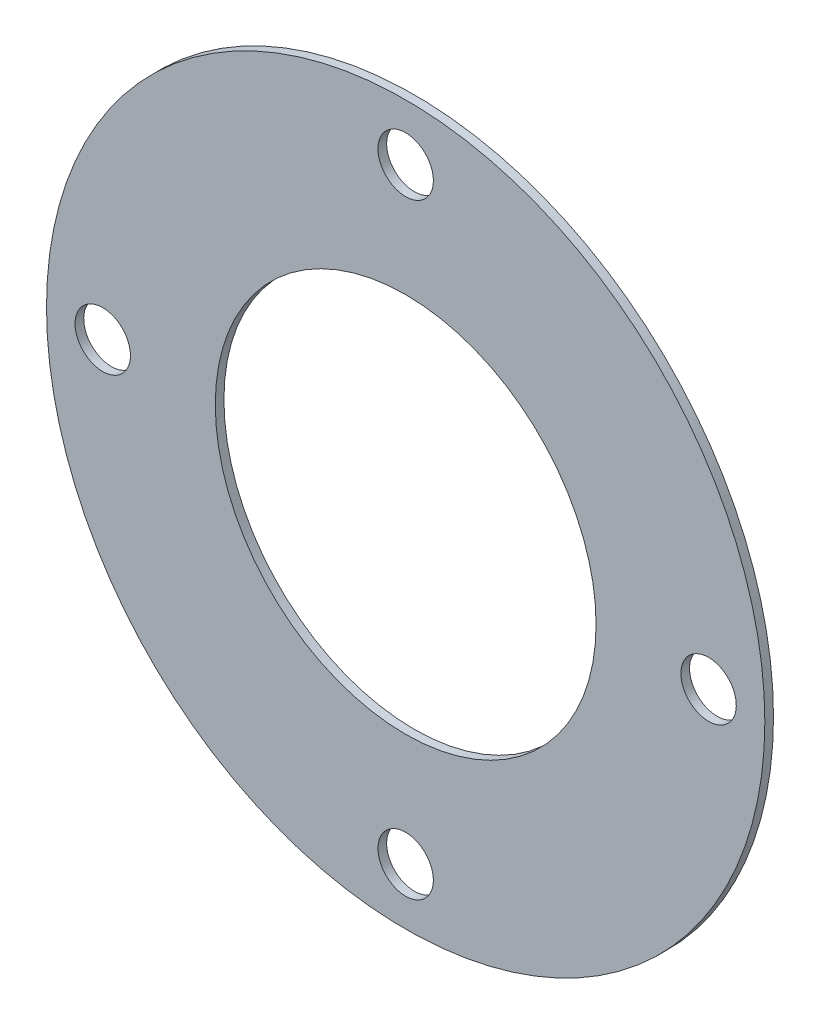
ISO-10303-21;
HEADER;
FILE_DESCRIPTION(('STEP AP214'),'2;1');
FILE_NAME('part.step','',(''),(''),'','','');
FILE_SCHEMA(('AUTOMOTIVE_DESIGN { 1 0 10303 214 1 1 1 1 }'));
ENDSEC;
DATA;
#1=APPLICATION_CONTEXT('core data for automotive mechanical design processes');
#2=APPLICATION_PROTOCOL_DEFINITION('international standard','automotive_design',2000,#1);
#3=PRODUCT_CONTEXT('',#1,'mechanical');
#4=PRODUCT('Part','Part','',(#3));
#5=PRODUCT_RELATED_PRODUCT_CATEGORY('part','',(#4));
#6=PRODUCT_DEFINITION_FORMATION('','',#4);
#7=PRODUCT_DEFINITION_CONTEXT('part definition',#1,'design');
#8=PRODUCT_DEFINITION('design','',#6,#7);
#9=PRODUCT_DEFINITION_SHAPE('','',#8);
#10=(LENGTH_UNIT() NAMED_UNIT(*) SI_UNIT(.MILLI.,.METRE.));
#11=(NAMED_UNIT(*) PLANE_ANGLE_UNIT() SI_UNIT($,.RADIAN.));
#12=(NAMED_UNIT(*) SI_UNIT($,.STERADIAN.) SOLID_ANGLE_UNIT());
#13=UNCERTAINTY_MEASURE_WITH_UNIT(LENGTH_MEASURE(1.E-05),#10,'distance_accuracy_value','');
#14=(GEOMETRIC_REPRESENTATION_CONTEXT(3) GLOBAL_UNCERTAINTY_ASSIGNED_CONTEXT((#13)) GLOBAL_UNIT_ASSIGNED_CONTEXT((#10,
#11,#12)) REPRESENTATION_CONTEXT('',''));
#15=CARTESIAN_POINT('',(0.,0.,0.));
#16=DIRECTION('',(0.,0.,1.));
#17=DIRECTION('',(1.,0.,0.));
#18=AXIS2_PLACEMENT_3D('',#15,#16,#17);
#19=CARTESIAN_POINT('',(-17.5,0.,-58.1919926395416));
#20=DIRECTION('',(0.,0.,1.));
#21=DIRECTION('',(0.,-1.,0.));
#22=AXIS2_PLACEMENT_3D('',#19,#20,#21);
#23=CYLINDRICAL_SURFACE('',#22,1.6);
#24=CARTESIAN_POINT('',(-17.5,0.,0.));
#25=DIRECTION('',(0.,0.,1.));
#26=DIRECTION('',(0.,-1.,0.));
#27=AXIS2_PLACEMENT_3D('',#24,#25,#26);
#28=CIRCLE('',#27,1.6);
#29=CARTESIAN_POINT('',(-17.5,-1.6,0.));
#30=VERTEX_POINT('',#29);
#31=EDGE_CURVE('E52',#30,#30,#28,.T.);
#32=ORIENTED_EDGE('',*,*,#31,.F.);
#33=EDGE_LOOP('',(#32));
#34=FACE_BOUND('',#33,.T.);
#35=CARTESIAN_POINT('',(-17.5,0.,0.499999999999998));
#36=DIRECTION('',(0.,0.,-1.));
#37=DIRECTION('',(0.,-1.,0.));
#38=AXIS2_PLACEMENT_3D('',#35,#36,#37);
#39=CIRCLE('',#38,1.6);
#40=CARTESIAN_POINT('',(-17.5,-1.6,0.499999999999998));
#41=VERTEX_POINT('',#40);
#42=EDGE_CURVE('E23',#41,#41,#39,.T.);
#43=ORIENTED_EDGE('',*,*,#42,.F.);
#44=EDGE_LOOP('',(#43));
#45=FACE_BOUND('',#44,.T.);
#46=ADVANCED_FACE('F15',(#34,#45),#23,.F.);
#47=CARTESIAN_POINT('',(0.,17.5,-58.1919926395416));
#48=DIRECTION('',(0.,0.,1.));
#49=DIRECTION('',(-1.,0.,0.));
#50=AXIS2_PLACEMENT_3D('',#47,#48,#49);
#51=CYLINDRICAL_SURFACE('',#50,1.6);
#52=CARTESIAN_POINT('',(0.,17.5,0.));
#53=DIRECTION('',(0.,0.,1.));
#54=DIRECTION('',(-1.,0.,0.));
#55=AXIS2_PLACEMENT_3D('',#52,#53,#54);
#56=CIRCLE('',#55,1.6);
#57=CARTESIAN_POINT('',(-1.6,17.5,0.));
#58=VERTEX_POINT('',#57);
#59=EDGE_CURVE('E48',#58,#58,#56,.T.);
#60=ORIENTED_EDGE('',*,*,#59,.F.);
#61=EDGE_LOOP('',(#60));
#62=FACE_BOUND('',#61,.T.);
#63=CARTESIAN_POINT('',(0.,17.5,0.499999999999998));
#64=DIRECTION('',(0.,0.,-1.));
#65=DIRECTION('',(-1.,0.,0.));
#66=AXIS2_PLACEMENT_3D('',#63,#64,#65);
#67=CIRCLE('',#66,1.6);
#68=CARTESIAN_POINT('',(-1.6,17.5,0.499999999999998));
#69=VERTEX_POINT('',#68);
#70=EDGE_CURVE('E27',#69,#69,#67,.T.);
#71=ORIENTED_EDGE('',*,*,#70,.F.);
#72=EDGE_LOOP('',(#71));
#73=FACE_BOUND('',#72,.T.);
#74=ADVANCED_FACE('F76',(#62,#73),#51,.F.);
#75=CARTESIAN_POINT('',(17.5,0.,-58.1919926395416));
#76=DIRECTION('',(0.,0.,1.));
#77=DIRECTION('',(0.,1.,0.));
#78=AXIS2_PLACEMENT_3D('',#75,#76,#77);
#79=CYLINDRICAL_SURFACE('',#78,1.6);
#80=CARTESIAN_POINT('',(17.5,0.,0.));
#81=DIRECTION('',(0.,0.,1.));
#82=DIRECTION('',(0.,1.,0.));
#83=AXIS2_PLACEMENT_3D('',#80,#81,#82);
#84=CIRCLE('',#83,1.6);
#85=CARTESIAN_POINT('',(17.5,1.6,0.));
#86=VERTEX_POINT('',#85);
#87=EDGE_CURVE('E43',#86,#86,#84,.T.);
#88=ORIENTED_EDGE('',*,*,#87,.F.);
#89=EDGE_LOOP('',(#88));
#90=FACE_BOUND('',#89,.T.);
#91=CARTESIAN_POINT('',(17.5,0.,0.499999999999998));
#92=DIRECTION('',(0.,0.,-1.));
#93=DIRECTION('',(0.,1.,0.));
#94=AXIS2_PLACEMENT_3D('',#91,#92,#93);
#95=CIRCLE('',#94,1.6);
#96=CARTESIAN_POINT('',(17.5,1.6,0.499999999999998));
#97=VERTEX_POINT('',#96);
#98=EDGE_CURVE('E40',#97,#97,#95,.T.);
#99=ORIENTED_EDGE('',*,*,#98,.F.);
#100=EDGE_LOOP('',(#99));
#101=FACE_BOUND('',#100,.T.);
#102=ADVANCED_FACE('F82',(#90,#101),#79,.F.);
#103=CARTESIAN_POINT('',(0.,-17.5,-58.1919926395416));
#104=DIRECTION('',(0.,0.,1.));
#105=DIRECTION('',(1.,0.,0.));
#106=AXIS2_PLACEMENT_3D('',#103,#104,#105);
#107=CYLINDRICAL_SURFACE('',#106,1.6);
#108=CARTESIAN_POINT('',(0.,-17.5,0.));
#109=DIRECTION('',(0.,0.,1.));
#110=DIRECTION('',(1.,0.,0.));
#111=AXIS2_PLACEMENT_3D('',#108,#109,#110);
#112=CIRCLE('',#111,1.6);
#113=CARTESIAN_POINT('',(1.6,-17.5,0.));
#114=VERTEX_POINT('',#113);
#115=EDGE_CURVE('E33',#114,#114,#112,.T.);
#116=ORIENTED_EDGE('',*,*,#115,.F.);
#117=EDGE_LOOP('',(#116));
#118=FACE_BOUND('',#117,.T.);
#119=CARTESIAN_POINT('',(0.,-17.5,0.499999999999998));
#120=DIRECTION('',(0.,0.,-1.));
#121=DIRECTION('',(1.,0.,0.));
#122=AXIS2_PLACEMENT_3D('',#119,#120,#121);
#123=CIRCLE('',#122,1.6);
#124=CARTESIAN_POINT('',(1.6,-17.5,0.499999999999998));
#125=VERTEX_POINT('',#124);
#126=EDGE_CURVE('E37',#125,#125,#123,.T.);
#127=ORIENTED_EDGE('',*,*,#126,.F.);
#128=EDGE_LOOP('',(#127));
#129=FACE_BOUND('',#128,.T.);
#130=ADVANCED_FACE('F72',(#118,#129),#107,.F.);
#131=CARTESIAN_POINT('',(0.,0.,0.));
#132=DIRECTION('',(0.,0.,1.));
#133=DIRECTION('',(-1.,0.,0.));
#134=AXIS2_PLACEMENT_3D('',#131,#132,#133);
#135=CYLINDRICAL_SURFACE('',#134,11.);
#136=CARTESIAN_POINT('',(0.,0.,0.5));
#137=DIRECTION('',(0.,0.,-1.));
#138=DIRECTION('',(-1.,0.,0.));
#139=AXIS2_PLACEMENT_3D('',#136,#137,#138);
#140=CIRCLE('',#139,11.);
#141=CARTESIAN_POINT('',(-11.,0.,0.5));
#142=VERTEX_POINT('',#141);
#143=EDGE_CURVE('E34',#142,#142,#140,.T.);
#144=ORIENTED_EDGE('',*,*,#143,.F.);
#145=EDGE_LOOP('',(#144));
#146=FACE_BOUND('',#145,.T.);
#147=CARTESIAN_POINT('',(0.,0.,0.));
#148=DIRECTION('',(0.,0.,1.));
#149=DIRECTION('',(-1.,0.,0.));
#150=AXIS2_PLACEMENT_3D('',#147,#148,#149);
#151=CIRCLE('',#150,11.);
#152=CARTESIAN_POINT('',(-11.,0.,0.));
#153=VERTEX_POINT('',#152);
#154=EDGE_CURVE('E30',#153,#153,#151,.T.);
#155=ORIENTED_EDGE('',*,*,#154,.F.);
#156=EDGE_LOOP('',(#155));
#157=FACE_BOUND('',#156,.T.);
#158=ADVANCED_FACE('F64',(#146,#157),#135,.F.);
#159=CARTESIAN_POINT('',(0.,0.,0.));
#160=DIRECTION('',(0.,0.,1.));
#161=DIRECTION('',(-1.,0.,0.));
#162=AXIS2_PLACEMENT_3D('',#159,#160,#161);
#163=CYLINDRICAL_SURFACE('',#162,20.75);
#164=CARTESIAN_POINT('',(0.,0.,0.5));
#165=DIRECTION('',(0.,0.,-1.));
#166=DIRECTION('',(-1.,0.,0.));
#167=AXIS2_PLACEMENT_3D('',#164,#165,#166);
#168=CIRCLE('',#167,20.75);
#169=CARTESIAN_POINT('',(-20.75,0.,0.5));
#170=VERTEX_POINT('',#169);
#171=EDGE_CURVE('E10',#170,#170,#168,.T.);
#172=ORIENTED_EDGE('',*,*,#171,.T.);
#173=EDGE_LOOP('',(#172));
#174=FACE_BOUND('',#173,.T.);
#175=CARTESIAN_POINT('',(0.,0.,0.));
#176=DIRECTION('',(0.,0.,-1.));
#177=DIRECTION('',(-1.,0.,0.));
#178=AXIS2_PLACEMENT_3D('',#175,#176,#177);
#179=CIRCLE('',#178,20.75);
#180=CARTESIAN_POINT('',(-20.75,0.,0.));
#181=VERTEX_POINT('',#180);
#182=EDGE_CURVE('E19',#181,#181,#179,.T.);
#183=ORIENTED_EDGE('',*,*,#182,.F.);
#184=EDGE_LOOP('',(#183));
#185=FACE_BOUND('',#184,.T.);
#186=ADVANCED_FACE('F61',(#174,#185),#163,.T.);
#187=CARTESIAN_POINT('',(0.,0.,0.5));
#188=DIRECTION('',(0.,0.,-1.));
#189=DIRECTION('',(-1.,0.,0.));
#190=AXIS2_PLACEMENT_3D('',#187,#188,#189);
#191=PLANE('',#190);
#192=ORIENTED_EDGE('',*,*,#171,.F.);
#193=EDGE_LOOP('',(#192));
#194=FACE_BOUND('',#193,.T.);
#195=ORIENTED_EDGE('',*,*,#42,.T.);
#196=EDGE_LOOP('',(#195));
#197=FACE_BOUND('',#196,.T.);
#198=ORIENTED_EDGE('',*,*,#70,.T.);
#199=EDGE_LOOP('',(#198));
#200=FACE_BOUND('',#199,.T.);
#201=ORIENTED_EDGE('',*,*,#98,.T.);
#202=EDGE_LOOP('',(#201));
#203=FACE_BOUND('',#202,.T.);
#204=ORIENTED_EDGE('',*,*,#126,.T.);
#205=EDGE_LOOP('',(#204));
#206=FACE_BOUND('',#205,.T.);
#207=ORIENTED_EDGE('',*,*,#143,.T.);
#208=EDGE_LOOP('',(#207));
#209=FACE_BOUND('',#208,.T.);
#210=ADVANCED_FACE('F63',(#194,#197,#200,#203,#206,#209),#191,.F.);
#211=CARTESIAN_POINT('',(0.,0.,0.));
#212=DIRECTION('',(0.,0.,-1.));
#213=DIRECTION('',(-1.,0.,0.));
#214=AXIS2_PLACEMENT_3D('',#211,#212,#213);
#215=PLANE('',#214);
#216=ORIENTED_EDGE('',*,*,#182,.T.);
#217=EDGE_LOOP('',(#216));
#218=FACE_BOUND('',#217,.T.);
#219=ORIENTED_EDGE('',*,*,#31,.T.);
#220=EDGE_LOOP('',(#219));
#221=FACE_BOUND('',#220,.T.);
#222=ORIENTED_EDGE('',*,*,#59,.T.);
#223=EDGE_LOOP('',(#222));
#224=FACE_BOUND('',#223,.T.);
#225=ORIENTED_EDGE('',*,*,#87,.T.);
#226=EDGE_LOOP('',(#225));
#227=FACE_BOUND('',#226,.T.);
#228=ORIENTED_EDGE('',*,*,#115,.T.);
#229=EDGE_LOOP('',(#228));
#230=FACE_BOUND('',#229,.T.);
#231=ORIENTED_EDGE('',*,*,#154,.T.);
#232=EDGE_LOOP('',(#231));
#233=FACE_BOUND('',#232,.T.);
#234=ADVANCED_FACE('F17',(#218,#221,#224,#227,#230,#233),#215,.T.);
#235=CLOSED_SHELL('',(#46,#74,#102,#130,#158,#186,#210,#234));
#236=MANIFOLD_SOLID_BREP('B1',#235);
#237=ADVANCED_BREP_SHAPE_REPRESENTATION('',(#18,#236),#14);
#238=SHAPE_DEFINITION_REPRESENTATION(#9,#237);
ENDSEC;
END-ISO-10303-21;
